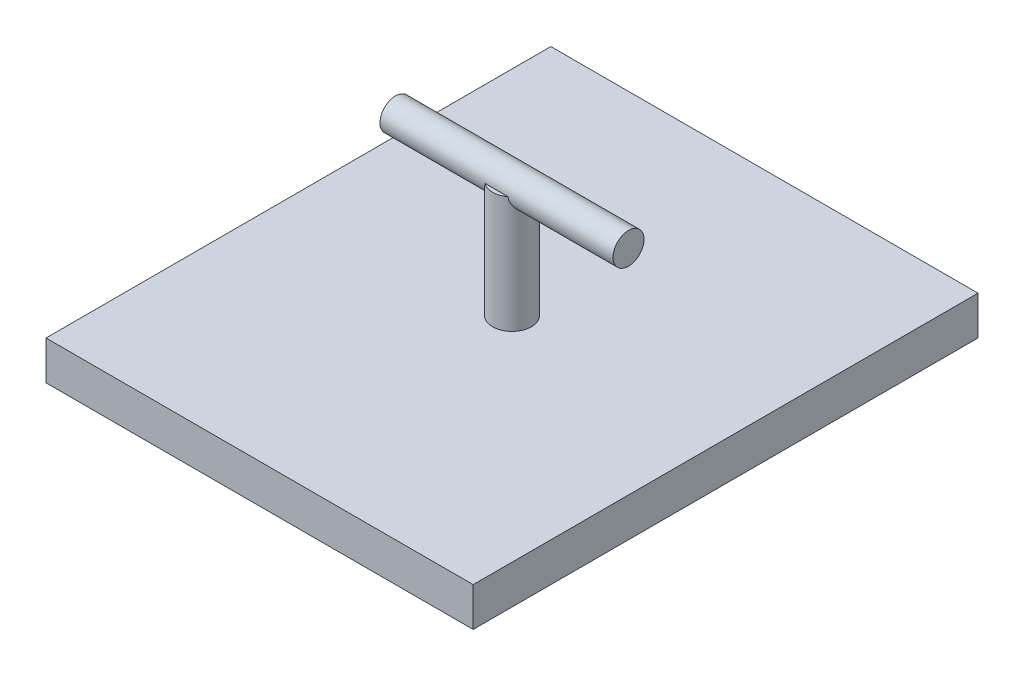
ISO-10303-21;
HEADER;
FILE_DESCRIPTION(('STEP AP214'),'2;1');
FILE_NAME('part.step','',(''),(''),'','','');
FILE_SCHEMA(('AUTOMOTIVE_DESIGN { 1 0 10303 214 1 1 1 1 }'));
ENDSEC;
DATA;
#1=APPLICATION_CONTEXT('core data for automotive mechanical design processes');
#2=APPLICATION_PROTOCOL_DEFINITION('international standard','automotive_design',2000,#1);
#3=PRODUCT_CONTEXT('',#1,'mechanical');
#4=PRODUCT('Part','Part','',(#3));
#5=PRODUCT_RELATED_PRODUCT_CATEGORY('part','',(#4));
#6=PRODUCT_DEFINITION_FORMATION('','',#4);
#7=PRODUCT_DEFINITION_CONTEXT('part definition',#1,'design');
#8=PRODUCT_DEFINITION('design','',#6,#7);
#9=PRODUCT_DEFINITION_SHAPE('','',#8);
#10=(LENGTH_UNIT() NAMED_UNIT(*) SI_UNIT(.MILLI.,.METRE.));
#11=(NAMED_UNIT(*) PLANE_ANGLE_UNIT() SI_UNIT($,.RADIAN.));
#12=(NAMED_UNIT(*) SI_UNIT($,.STERADIAN.) SOLID_ANGLE_UNIT());
#13=UNCERTAINTY_MEASURE_WITH_UNIT(LENGTH_MEASURE(1.E-05),#10,'distance_accuracy_value','');
#14=(GEOMETRIC_REPRESENTATION_CONTEXT(3) GLOBAL_UNCERTAINTY_ASSIGNED_CONTEXT((#13)) GLOBAL_UNIT_ASSIGNED_CONTEXT((#10,
#11,#12)) REPRESENTATION_CONTEXT('',''));
#15=CARTESIAN_POINT('',(0.,0.,0.));
#16=DIRECTION('',(0.,0.,1.));
#17=DIRECTION('',(1.,0.,0.));
#18=AXIS2_PLACEMENT_3D('',#15,#16,#17);
#19=CARTESIAN_POINT('',(29.9999999999999,0.,0.));
#20=DIRECTION('',(1.,0.,0.));
#21=DIRECTION('',(0.,0.,-1.));
#22=AXIS2_PLACEMENT_3D('',#19,#20,#21);
#23=PLANE('',#22);
#24=CARTESIAN_POINT('',(29.9999999999999,0.,0.));
#25=DIRECTION('',(-1.,0.,0.));
#26=DIRECTION('',(0.,0.,1.));
#27=AXIS2_PLACEMENT_3D('',#24,#25,#26);
#28=CIRCLE('',#27,4.);
#29=CARTESIAN_POINT('',(29.9999999999999,0.,4.));
#30=VERTEX_POINT('',#29);
#31=EDGE_CURVE('E138',#30,#30,#28,.T.);
#32=ORIENTED_EDGE('',*,*,#31,.F.);
#33=EDGE_LOOP('',(#32));
#34=FACE_BOUND('',#33,.T.);
#35=ADVANCED_FACE('F43',(#34),#23,.T.);
#36=CARTESIAN_POINT('',(-30.,0.,0.));
#37=DIRECTION('',(-1.,0.,0.));
#38=DIRECTION('',(0.,0.,1.));
#39=AXIS2_PLACEMENT_3D('',#36,#37,#38);
#40=CYLINDRICAL_SURFACE('',#39,4.);
#41=DIRECTION('',(-1.,0.,0.));
#42=VECTOR('',#41,1.);
#43=CARTESIAN_POINT('',(-30.,0.,-4.));
#44=LINE('',#43,#42);
#45=CARTESIAN_POINT('',(-3.,0.,-4.));
#46=VERTEX_POINT('',#45);
#47=CARTESIAN_POINT('',(3.,0.,-4.));
#48=VERTEX_POINT('',#47);
#49=EDGE_CURVE('E11',#46,#48,#44,.F.);
#50=ORIENTED_EDGE('',*,*,#49,.F.);
#51=CARTESIAN_POINT('',(-3.,0.,4.));
#52=CARTESIAN_POINT('',(-2.99995182787822,-0.0758839512120037,4.0000172442197));
#53=CARTESIAN_POINT('',(-3.00287794283945,-0.151737082152613,3.99784133479927));
#54=CARTESIAN_POINT('',(-3.01430346027332,-0.302655166726338,3.98924372965557));
#55=CARTESIAN_POINT('',(-3.02279340760076,-0.377721238393577,3.98282923680378));
#56=CARTESIAN_POINT('',(-3.04482610821815,-0.525609756090726,3.96600676721711));
#57=CARTESIAN_POINT('',(-3.05830014562958,-0.598448764454386,3.95565304776434));
#58=CARTESIAN_POINT('',(-3.08972240011624,-0.742514021673158,3.93115992154878));
#59=CARTESIAN_POINT('',(-3.1076728303431,-0.813739453709919,3.91701864193996));
#60=CARTESIAN_POINT('',(-3.1814203655067,-1.07465465068644,3.85788645632627));
#61=CARTESIAN_POINT('',(-3.24941719011977,-1.258492770828,3.80151495767512));
#62=CARTESIAN_POINT('',(-3.36335898862908,-1.52268734302426,3.70006231378467));
#63=CARTESIAN_POINT('',(-3.40351971759372,-1.60915460496881,3.66324320745199));
#64=CARTESIAN_POINT('',(-3.48663491099409,-1.77820879603121,3.5842231916031));
#65=CARTESIAN_POINT('',(-3.52958842582172,-1.86079702782225,3.54202410675605));
#66=CARTESIAN_POINT('',(-3.63300092902873,-2.05114503474044,3.43635816877644));
#67=CARTESIAN_POINT('',(-3.69420263333461,-2.15728235592877,3.37069881632494));
#68=CARTESIAN_POINT('',(-3.81773266936584,-2.36258179860212,3.23012143767123));
#69=CARTESIAN_POINT('',(-3.88006139113919,-2.46174144477991,3.15520015155313));
#70=CARTESIAN_POINT('',(-4.00395278198727,-2.65271644607596,2.99641106604159));
#71=CARTESIAN_POINT('',(-4.06551678559214,-2.74454679638046,2.91256239738764));
#72=CARTESIAN_POINT('',(-4.18645638811208,-2.92070352963931,2.73588329549457));
#73=CARTESIAN_POINT('',(-4.24583169281856,-3.00502890590162,2.64305166078592));
#74=CARTESIAN_POINT('',(-4.3957561156391,-3.21415196903715,2.38960176282309));
#75=CARTESIAN_POINT('',(-4.48346431084525,-3.3326182944242,2.22191651732621));
#76=CARTESIAN_POINT('',(-4.64330256804725,-3.54472666863029,1.86490701455669));
#77=CARTESIAN_POINT('',(-4.71545396590355,-3.63840275743935,1.67561294576412));
#78=CARTESIAN_POINT('',(-4.82831089934389,-3.78342427646884,1.31063563644204));
#79=CARTESIAN_POINT('',(-4.87221514889498,-3.83916590750086,1.13770363481765));
#80=CARTESIAN_POINT('',(-4.94171963049312,-3.92699890197435,0.782370380917402));
#81=CARTESIAN_POINT('',(-4.96733034656071,-3.95910381194076,0.599974616720662));
#82=CARTESIAN_POINT('',(-4.99815922579613,-3.99771605753087,0.230096381411205));
#83=CARTESIAN_POINT('',(-5.00330645831563,-4.00413435858864,0.0425984816268359));
#84=CARTESIAN_POINT('',(-4.99253869586592,-3.99067147682623,-0.330833896816364));
#85=CARTESIAN_POINT('',(-4.97662285118408,-3.97078923300702,-0.516768312097622));
#86=CARTESIAN_POINT('',(-4.92656782991578,-3.90786469247283,-0.87136305238285));
#87=CARTESIAN_POINT('',(-4.89346948356484,-3.86614416195021,-1.04041248586898));
#88=CARTESIAN_POINT('',(-4.81209238959492,-3.76261270089102,-1.36833589163498));
#89=CARTESIAN_POINT('',(-4.76380908651497,-3.7007957412724,-1.527206793134));
#90=CARTESIAN_POINT('',(-4.64971647646164,-3.55278849968009,-1.84707554506929));
#91=CARTESIAN_POINT('',(-4.58266606832004,-3.46482265359562,-2.00680104886884));
#92=CARTESIAN_POINT('',(-4.43786536967305,-3.27090205959575,-2.30944878399931));
#93=CARTESIAN_POINT('',(-4.360111642347,-3.16494153104913,-2.45236559063698));
#94=CARTESIAN_POINT('',(-4.18111155288389,-2.9139396863621,-2.74845365044915));
#95=CARTESIAN_POINT('',(-4.07832137803861,-2.76534220050287,-2.89769469310453));
#96=CARTESIAN_POINT('',(-3.9221298420074,-2.52718627050552,-3.10230804358847));
#97=CARTESIAN_POINT('',(-3.86965254454364,-2.44512501236429,-3.16738635570626));
#98=CARTESIAN_POINT('',(-3.76507373489572,-2.27600253939464,-3.29101550855261));
#99=CARTESIAN_POINT('',(-3.71297223475636,-2.1889411651004,-3.3495661409223));
#100=CARTESIAN_POINT('',(-3.56862015261604,-1.93722631215424,-3.5047783442769));
#101=CARTESIAN_POINT('',(-3.47799806112874,-1.76679467478675,-3.59393900494401));
#102=CARTESIAN_POINT('',(-3.35285010125728,-1.49923322346361,-3.70966941062843));
#103=CARTESIAN_POINT('',(-3.31303076485051,-1.40833857184373,-3.74516801125376));
#104=CARTESIAN_POINT('',(-3.23834004092699,-1.22233803639522,-3.80993229160584));
#105=CARTESIAN_POINT('',(-3.20346793388259,-1.12723276760636,-3.83919887803084));
#106=CARTESIAN_POINT('',(-3.14570017357785,-0.949345669584446,-3.88660905508885));
#107=CARTESIAN_POINT('',(-3.12177671618877,-0.867177019026397,-3.9057952405824));
#108=CARTESIAN_POINT('',(-3.07962493185848,-0.700427011133482,-3.93911505883391));
#109=CARTESIAN_POINT('',(-3.06139246904959,-0.61584745491202,-3.95325236189381));
#110=CARTESIAN_POINT('',(-3.03139214457791,-0.443409166907625,-3.97631108834135));
#111=CARTESIAN_POINT('',(-3.0197316902085,-0.355519677888376,-3.98514599651582));
#112=CARTESIAN_POINT('',(-3.00398108602478,-0.178443281775607,-3.99701436267849));
#113=CARTESIAN_POINT('',(-2.99991179386177,-0.0892534766609155,-4.00003183731111));
#114=CARTESIAN_POINT('',(-3.00000000000017,0.,-4.00000000000002));
#115=B_SPLINE_CURVE_WITH_KNOTS('',3,(#51,#52,#53,#54,#55,#56,#57,#58,#59,#60,#61,#62,#63,#64,
#65,#66,#67,#68,#69,#70,#71,#72,#73,#74,#75,#76,#77,#78,#79,#80,#81,#82,#83,#84,#85,#86,#87,#88,
#89,#90,#91,#92,#93,#94,#95,#96,#97,#98,#99,#100,#101,#102,#103,#104,#105,#106,#107,#108,#109,
#110,#111,#112,#113,#114),.UNSPECIFIED.,.F.,.F.,(4,2,2,2,2,2,2,2,2,2,2,2,2,2,2,2,2,2,2,2,2,2,2,
2,2,2,2,2,2,2,2,4),(0.,0.227514386943003,0.454643136344802,0.678750566837707,0.902969017631836,
1.51087923212397,1.81735094177795,2.12371898388142,2.54020752782497,2.95684308254033,
3.37260313311497,3.78841886855926,4.45547797636936,5.12161632216695,5.68000290471996,
6.23806921871323,6.79806822770702,7.35808982849605,7.88757946016121,8.41722808957462,
8.99795349172704,9.57886580084644,10.2791805892878,10.6303779353209,10.9815864881139,
11.6169995493873,11.9328954092994,12.248745277946,12.5115441892466,12.7741516672509,
13.0409350062526,13.3084502917263),.UNSPECIFIED.);
#116=CARTESIAN_POINT('',(-3.,0.,4.));
#117=VERTEX_POINT('',#116);
#118=EDGE_CURVE('E146',#117,#46,#115,.T.);
#119=ORIENTED_EDGE('',*,*,#118,.F.);
#120=DIRECTION('',(-1.,0.,0.));
#121=VECTOR('',#120,1.);
#122=CARTESIAN_POINT('',(-30.,0.,4.));
#123=LINE('',#122,#121);
#124=CARTESIAN_POINT('',(3.,0.,4.));
#125=VERTEX_POINT('',#124);
#126=EDGE_CURVE('E142',#125,#117,#123,.T.);
#127=ORIENTED_EDGE('',*,*,#126,.F.);
#128=CARTESIAN_POINT('',(3.,0.,-4.));
#129=CARTESIAN_POINT('',(2.99995182787822,-0.0758839512120037,-4.0000172442197));
#130=CARTESIAN_POINT('',(3.00287794283945,-0.151737082152613,-3.99784133479927));
#131=CARTESIAN_POINT('',(3.01430346027332,-0.302655166726338,-3.98924372965557));
#132=CARTESIAN_POINT('',(3.02279340760076,-0.377721238393577,-3.98282923680378));
#133=CARTESIAN_POINT('',(3.04482610821815,-0.525609756090726,-3.96600676721711));
#134=CARTESIAN_POINT('',(3.05830014562958,-0.598448764454386,-3.95565304776434));
#135=CARTESIAN_POINT('',(3.08972240011624,-0.742514021673158,-3.93115992154878));
#136=CARTESIAN_POINT('',(3.1076728303431,-0.813739453709919,-3.91701864193996));
#137=CARTESIAN_POINT('',(3.1814203655067,-1.07465465068644,-3.85788645632627));
#138=CARTESIAN_POINT('',(3.24941719011977,-1.258492770828,-3.80151495767512));
#139=CARTESIAN_POINT('',(3.36335898862908,-1.52268734302426,-3.70006231378467));
#140=CARTESIAN_POINT('',(3.40351971759372,-1.60915460496881,-3.66324320745199));
#141=CARTESIAN_POINT('',(3.48663491099409,-1.77820879603121,-3.5842231916031));
#142=CARTESIAN_POINT('',(3.52958842582172,-1.86079702782225,-3.54202410675605));
#143=CARTESIAN_POINT('',(3.63300092902873,-2.05114503474044,-3.43635816877644));
#144=CARTESIAN_POINT('',(3.69420263333461,-2.15728235592877,-3.37069881632494));
#145=CARTESIAN_POINT('',(3.81773266936584,-2.36258179860212,-3.23012143767123));
#146=CARTESIAN_POINT('',(3.88006139113919,-2.46174144477991,-3.15520015155313));
#147=CARTESIAN_POINT('',(4.00395278198727,-2.65271644607596,-2.99641106604159));
#148=CARTESIAN_POINT('',(4.06551678559214,-2.74454679638046,-2.91256239738764));
#149=CARTESIAN_POINT('',(4.18645638811208,-2.92070352963931,-2.73588329549457));
#150=CARTESIAN_POINT('',(4.24583169281856,-3.00502890590162,-2.64305166078592));
#151=CARTESIAN_POINT('',(4.3957561156391,-3.21415196903715,-2.38960176282309));
#152=CARTESIAN_POINT('',(4.48346431084525,-3.3326182944242,-2.22191651732621));
#153=CARTESIAN_POINT('',(4.64330256804725,-3.54472666863029,-1.86490701455669));
#154=CARTESIAN_POINT('',(4.71545396590355,-3.63840275743935,-1.67561294576412));
#155=CARTESIAN_POINT('',(4.82831089934389,-3.78342427646884,-1.31063563644204));
#156=CARTESIAN_POINT('',(4.87221514889498,-3.83916590750086,-1.13770363481765));
#157=CARTESIAN_POINT('',(4.94171963049312,-3.92699890197435,-0.782370380917402));
#158=CARTESIAN_POINT('',(4.96733034656071,-3.95910381194076,-0.599974616720662));
#159=CARTESIAN_POINT('',(4.99815922579613,-3.99771605753087,-0.230096381411205));
#160=CARTESIAN_POINT('',(5.00330645831563,-4.00413435858864,-0.0425984816268359));
#161=CARTESIAN_POINT('',(4.99253869586592,-3.99067147682623,0.330833896816364));
#162=CARTESIAN_POINT('',(4.97662285118408,-3.97078923300702,0.516768312097622));
#163=CARTESIAN_POINT('',(4.92656782991578,-3.90786469247283,0.87136305238285));
#164=CARTESIAN_POINT('',(4.89346948356484,-3.86614416195021,1.04041248586898));
#165=CARTESIAN_POINT('',(4.81209238959492,-3.76261270089102,1.36833589163498));
#166=CARTESIAN_POINT('',(4.76380908651497,-3.7007957412724,1.527206793134));
#167=CARTESIAN_POINT('',(4.64971647646164,-3.55278849968009,1.84707554506929));
#168=CARTESIAN_POINT('',(4.58266606832004,-3.46482265359562,2.00680104886884));
#169=CARTESIAN_POINT('',(4.43786536967305,-3.27090205959575,2.30944878399931));
#170=CARTESIAN_POINT('',(4.360111642347,-3.16494153104913,2.45236559063698));
#171=CARTESIAN_POINT('',(4.18111155288389,-2.9139396863621,2.74845365044915));
#172=CARTESIAN_POINT('',(4.07832137803861,-2.76534220050287,2.89769469310453));
#173=CARTESIAN_POINT('',(3.9221298420074,-2.52718627050552,3.10230804358847));
#174=CARTESIAN_POINT('',(3.86965254454364,-2.44512501236429,3.16738635570626));
#175=CARTESIAN_POINT('',(3.76507373489572,-2.27600253939464,3.29101550855261));
#176=CARTESIAN_POINT('',(3.71297223475636,-2.1889411651004,3.3495661409223));
#177=CARTESIAN_POINT('',(3.56862015261604,-1.93722631215424,3.5047783442769));
#178=CARTESIAN_POINT('',(3.47799806112874,-1.76679467478675,3.59393900494401));
#179=CARTESIAN_POINT('',(3.35285010125728,-1.49923322346361,3.70966941062843));
#180=CARTESIAN_POINT('',(3.31303076485051,-1.40833857184373,3.74516801125376));
#181=CARTESIAN_POINT('',(3.23834004092699,-1.22233803639522,3.80993229160584));
#182=CARTESIAN_POINT('',(3.20346793388259,-1.12723276760636,3.83919887803084));
#183=CARTESIAN_POINT('',(3.14570017357785,-0.949345669584446,3.88660905508885));
#184=CARTESIAN_POINT('',(3.12177671618877,-0.867177019026397,3.9057952405824));
#185=CARTESIAN_POINT('',(3.07962493185848,-0.700427011133482,3.93911505883391));
#186=CARTESIAN_POINT('',(3.06139246904959,-0.61584745491202,3.95325236189381));
#187=CARTESIAN_POINT('',(3.03139214457791,-0.443409166907625,3.97631108834135));
#188=CARTESIAN_POINT('',(3.0197316902085,-0.355519677888376,3.98514599651582));
#189=CARTESIAN_POINT('',(3.00398108602478,-0.178443281775607,3.99701436267849));
#190=CARTESIAN_POINT('',(2.99991179386177,-0.0892534766609155,4.00003183731111));
#191=CARTESIAN_POINT('',(3.00000000000017,0.,4.00000000000002));
#192=B_SPLINE_CURVE_WITH_KNOTS('',3,(#128,#129,#130,#131,#132,#133,#134,#135,#136,#137,#138,
#139,#140,#141,#142,#143,#144,#145,#146,#147,#148,#149,#150,#151,#152,#153,#154,#155,#156,#157,
#158,#159,#160,#161,#162,#163,#164,#165,#166,#167,#168,#169,#170,#171,#172,#173,#174,#175,#176,
#177,#178,#179,#180,#181,#182,#183,#184,#185,#186,#187,#188,#189,#190,#191),.UNSPECIFIED.,.F.,
.F.,(4,2,2,2,2,2,2,2,2,2,2,2,2,2,2,2,2,2,2,2,2,2,2,2,2,2,2,2,2,2,2,4),(0.,0.227514386943003,
0.454643136344802,0.678750566837707,0.902969017631836,1.51087923212397,1.81735094177795,
2.12371898388142,2.54020752782497,2.95684308254033,3.37260313311497,3.78841886855926,
4.45547797636936,5.12161632216695,5.68000290471996,6.23806921871323,6.79806822770702,
7.35808982849605,7.88757946016121,8.41722808957462,8.99795349172704,9.57886580084644,
10.2791805892878,10.6303779353209,10.9815864881139,11.6169995493873,11.9328954092994,
12.248745277946,12.5115441892466,12.7741516672509,13.0409350062526,13.3084502917263),.UNSPECIFIED.);
#193=EDGE_CURVE('E51',#48,#125,#192,.T.);
#194=ORIENTED_EDGE('',*,*,#193,.F.);
#195=EDGE_LOOP('',(#50,#119,#127,#194));
#196=FACE_BOUND('',#195,.T.);
#197=ORIENTED_EDGE('',*,*,#31,.T.);
#198=EDGE_LOOP('',(#197));
#199=FACE_BOUND('',#198,.T.);
#200=CARTESIAN_POINT('',(-30.,0.,0.));
#201=DIRECTION('',(-1.,0.,0.));
#202=DIRECTION('',(0.,0.,1.));
#203=AXIS2_PLACEMENT_3D('',#200,#201,#202);
#204=CIRCLE('',#203,4.);
#205=CARTESIAN_POINT('',(-30.,0.,4.));
#206=VERTEX_POINT('',#205);
#207=EDGE_CURVE('E134',#206,#206,#204,.T.);
#208=ORIENTED_EDGE('',*,*,#207,.F.);
#209=EDGE_LOOP('',(#208));
#210=FACE_BOUND('',#209,.T.);
#211=ADVANCED_FACE('F157',(#196,#199,#210),#40,.T.);
#212=CARTESIAN_POINT('',(-30.,0.,0.));
#213=DIRECTION('',(1.,0.,0.));
#214=DIRECTION('',(0.,0.,-1.));
#215=AXIS2_PLACEMENT_3D('',#212,#213,#214);
#216=PLANE('',#215);
#217=ORIENTED_EDGE('',*,*,#207,.T.);
#218=EDGE_LOOP('',(#217));
#219=FACE_BOUND('',#218,.T.);
#220=ADVANCED_FACE('F168',(#219),#216,.F.);
#221=CARTESIAN_POINT('',(0.,0.,0.));
#222=DIRECTION('',(0.,1.,0.));
#223=DIRECTION('',(0.,0.,1.));
#224=AXIS2_PLACEMENT_3D('',#221,#222,#223);
#225=PLANE('',#224);
#226=CARTESIAN_POINT('',(0.,0.,0.));
#227=DIRECTION('',(0.,1.,0.));
#228=DIRECTION('',(0.,0.,1.));
#229=AXIS2_PLACEMENT_3D('',#226,#227,#228);
#230=CIRCLE('',#229,5.);
#231=EDGE_CURVE('E133',#48,#46,#230,.T.);
#232=ORIENTED_EDGE('',*,*,#231,.T.);
#233=ORIENTED_EDGE('',*,*,#49,.T.);
#234=EDGE_LOOP('',(#232,#233));
#235=FACE_BOUND('',#234,.T.);
#236=ADVANCED_FACE('F165',(#235),#225,.T.);
#237=CARTESIAN_POINT('',(0.,-30.,0.));
#238=DIRECTION('',(0.,1.,0.));
#239=DIRECTION('',(0.,0.,1.));
#240=AXIS2_PLACEMENT_3D('',#237,#238,#239);
#241=CYLINDRICAL_SURFACE('',#240,5.);
#242=CARTESIAN_POINT('',(0.,-30.,0.));
#243=DIRECTION('',(0.,1.,0.));
#244=DIRECTION('',(0.,0.,1.));
#245=AXIS2_PLACEMENT_3D('',#242,#243,#244);
#246=CIRCLE('',#245,5.);
#247=CARTESIAN_POINT('',(0.,-30.,5.));
#248=VERTEX_POINT('',#247);
#249=EDGE_CURVE('E119',#248,#248,#246,.T.);
#250=ORIENTED_EDGE('',*,*,#249,.T.);
#251=EDGE_LOOP('',(#250));
#252=FACE_BOUND('',#251,.T.);
#253=ORIENTED_EDGE('',*,*,#231,.F.);
#254=ORIENTED_EDGE('',*,*,#193,.T.);
#255=EDGE_CURVE('E124',#117,#125,#230,.T.);
#256=ORIENTED_EDGE('',*,*,#255,.F.);
#257=ORIENTED_EDGE('',*,*,#118,.T.);
#258=EDGE_LOOP('',(#253,#254,#256,#257));
#259=FACE_BOUND('',#258,.T.);
#260=ADVANCED_FACE('F160',(#252,#259),#241,.T.);
#261=ORIENTED_EDGE('',*,*,#255,.T.);
#262=ORIENTED_EDGE('',*,*,#126,.T.);
#263=EDGE_LOOP('',(#261,#262));
#264=FACE_BOUND('',#263,.T.);
#265=ADVANCED_FACE('F164',(#264),#225,.T.);
#266=CARTESIAN_POINT('',(55.,-40.,65.));
#267=DIRECTION('',(-1.,0.,0.));
#268=DIRECTION('',(0.,0.,1.));
#269=AXIS2_PLACEMENT_3D('',#266,#267,#268);
#270=PLANE('',#269);
#271=DIRECTION('',(0.,0.,1.));
#272=VECTOR('',#271,1.);
#273=CARTESIAN_POINT('',(55.,-30.,65.));
#274=LINE('',#273,#272);
#275=CARTESIAN_POINT('',(55.,-30.,-65.));
#276=VERTEX_POINT('',#275);
#277=CARTESIAN_POINT('',(55.,-30.,65.));
#278=VERTEX_POINT('',#277);
#279=EDGE_CURVE('E117',#276,#278,#274,.T.);
#280=ORIENTED_EDGE('',*,*,#279,.T.);
#281=DIRECTION('',(0.,1.,0.));
#282=VECTOR('',#281,1.);
#283=CARTESIAN_POINT('',(55.,-40.,65.));
#284=LINE('',#283,#282);
#285=CARTESIAN_POINT('',(55.,-40.,65.));
#286=VERTEX_POINT('',#285);
#287=EDGE_CURVE('E95',#286,#278,#284,.T.);
#288=ORIENTED_EDGE('',*,*,#287,.F.);
#289=DIRECTION('',(0.,0.,1.));
#290=VECTOR('',#289,1.);
#291=CARTESIAN_POINT('',(55.,-40.,65.));
#292=LINE('',#291,#290);
#293=CARTESIAN_POINT('',(55.,-40.,-65.));
#294=VERTEX_POINT('',#293);
#295=EDGE_CURVE('E103',#294,#286,#292,.T.);
#296=ORIENTED_EDGE('',*,*,#295,.F.);
#297=DIRECTION('',(0.,1.,0.));
#298=VECTOR('',#297,1.);
#299=CARTESIAN_POINT('',(55.,-40.,-65.));
#300=LINE('',#299,#298);
#301=EDGE_CURVE('E285',#294,#276,#300,.T.);
#302=ORIENTED_EDGE('',*,*,#301,.T.);
#303=EDGE_LOOP('',(#280,#288,#296,#302));
#304=FACE_BOUND('',#303,.T.);
#305=ADVANCED_FACE('F115',(#304),#270,.F.);
#306=CARTESIAN_POINT('',(-55.,-40.,65.));
#307=DIRECTION('',(0.,0.,-1.));
#308=DIRECTION('',(-1.,0.,0.));
#309=AXIS2_PLACEMENT_3D('',#306,#307,#308);
#310=PLANE('',#309);
#311=DIRECTION('',(-1.,0.,0.));
#312=VECTOR('',#311,1.);
#313=CARTESIAN_POINT('',(-55.,-30.,65.));
#314=LINE('',#313,#312);
#315=CARTESIAN_POINT('',(-55.,-30.,65.));
#316=VERTEX_POINT('',#315);
#317=EDGE_CURVE('E272',#278,#316,#314,.T.);
#318=ORIENTED_EDGE('',*,*,#317,.T.);
#319=DIRECTION('',(0.,1.,0.));
#320=VECTOR('',#319,1.);
#321=CARTESIAN_POINT('',(-55.,-40.,65.));
#322=LINE('',#321,#320);
#323=CARTESIAN_POINT('',(-55.,-40.,65.));
#324=VERTEX_POINT('',#323);
#325=EDGE_CURVE('E98',#324,#316,#322,.T.);
#326=ORIENTED_EDGE('',*,*,#325,.F.);
#327=DIRECTION('',(-1.,0.,0.));
#328=VECTOR('',#327,1.);
#329=CARTESIAN_POINT('',(-55.,-40.,65.));
#330=LINE('',#329,#328);
#331=EDGE_CURVE('E91',#286,#324,#330,.T.);
#332=ORIENTED_EDGE('',*,*,#331,.F.);
#333=ORIENTED_EDGE('',*,*,#287,.T.);
#334=EDGE_LOOP('',(#318,#326,#332,#333));
#335=FACE_BOUND('',#334,.T.);
#336=ADVANCED_FACE('F93',(#335),#310,.F.);
#337=CARTESIAN_POINT('',(-55.,-40.,65.));
#338=DIRECTION('',(1.,0.,0.));
#339=DIRECTION('',(0.,0.,-1.));
#340=AXIS2_PLACEMENT_3D('',#337,#338,#339);
#341=PLANE('',#340);
#342=DIRECTION('',(0.,0.,-1.));
#343=VECTOR('',#342,1.);
#344=CARTESIAN_POINT('',(-55.,-30.,65.));
#345=LINE('',#344,#343);
#346=CARTESIAN_POINT('',(-55.,-30.,-65.));
#347=VERTEX_POINT('',#346);
#348=EDGE_CURVE('E276',#316,#347,#345,.T.);
#349=ORIENTED_EDGE('',*,*,#348,.T.);
#350=DIRECTION('',(0.,1.,0.));
#351=VECTOR('',#350,1.);
#352=CARTESIAN_POINT('',(-55.,-40.,-65.));
#353=LINE('',#352,#351);
#354=CARTESIAN_POINT('',(-55.,-40.,-65.));
#355=VERTEX_POINT('',#354);
#356=EDGE_CURVE('E126',#355,#347,#353,.T.);
#357=ORIENTED_EDGE('',*,*,#356,.F.);
#358=DIRECTION('',(0.,0.,-1.));
#359=VECTOR('',#358,1.);
#360=CARTESIAN_POINT('',(-55.,-40.,65.));
#361=LINE('',#360,#359);
#362=EDGE_CURVE('E102',#324,#355,#361,.T.);
#363=ORIENTED_EDGE('',*,*,#362,.F.);
#364=ORIENTED_EDGE('',*,*,#325,.T.);
#365=EDGE_LOOP('',(#349,#357,#363,#364));
#366=FACE_BOUND('',#365,.T.);
#367=ADVANCED_FACE('F227',(#366),#341,.F.);
#368=CARTESIAN_POINT('',(-55.,-40.,-65.));
#369=DIRECTION('',(0.,0.,1.));
#370=DIRECTION('',(1.,0.,0.));
#371=AXIS2_PLACEMENT_3D('',#368,#369,#370);
#372=PLANE('',#371);
#373=DIRECTION('',(1.,0.,0.));
#374=VECTOR('',#373,1.);
#375=CARTESIAN_POINT('',(-55.,-30.,-65.));
#376=LINE('',#375,#374);
#377=EDGE_CURVE('E113',#347,#276,#376,.T.);
#378=ORIENTED_EDGE('',*,*,#377,.T.);
#379=ORIENTED_EDGE('',*,*,#301,.F.);
#380=DIRECTION('',(1.,0.,0.));
#381=VECTOR('',#380,1.);
#382=CARTESIAN_POINT('',(-55.,-40.,-65.));
#383=LINE('',#382,#381);
#384=EDGE_CURVE('E108',#355,#294,#383,.T.);
#385=ORIENTED_EDGE('',*,*,#384,.F.);
#386=ORIENTED_EDGE('',*,*,#356,.T.);
#387=EDGE_LOOP('',(#378,#379,#385,#386));
#388=FACE_BOUND('',#387,.T.);
#389=ADVANCED_FACE('F236',(#388),#372,.F.);
#390=CARTESIAN_POINT('',(0.,-40.,0.));
#391=DIRECTION('',(0.,-1.,0.));
#392=DIRECTION('',(0.,0.,-1.));
#393=AXIS2_PLACEMENT_3D('',#390,#391,#392);
#394=PLANE('',#393);
#395=ORIENTED_EDGE('',*,*,#295,.T.);
#396=ORIENTED_EDGE('',*,*,#331,.T.);
#397=ORIENTED_EDGE('',*,*,#362,.T.);
#398=ORIENTED_EDGE('',*,*,#384,.T.);
#399=EDGE_LOOP('',(#395,#396,#397,#398));
#400=FACE_BOUND('',#399,.T.);
#401=ADVANCED_FACE('F106',(#400),#394,.T.);
#402=CARTESIAN_POINT('',(0.,-30.,0.));
#403=DIRECTION('',(0.,-1.,0.));
#404=DIRECTION('',(0.,0.,-1.));
#405=AXIS2_PLACEMENT_3D('',#402,#403,#404);
#406=PLANE('',#405);
#407=ORIENTED_EDGE('',*,*,#249,.F.);
#408=EDGE_LOOP('',(#407));
#409=FACE_BOUND('',#408,.T.);
#410=ORIENTED_EDGE('',*,*,#279,.F.);
#411=ORIENTED_EDGE('',*,*,#377,.F.);
#412=ORIENTED_EDGE('',*,*,#348,.F.);
#413=ORIENTED_EDGE('',*,*,#317,.F.);
#414=EDGE_LOOP('',(#410,#411,#412,#413));
#415=FACE_BOUND('',#414,.T.);
#416=ADVANCED_FACE('F255',(#409,#415),#406,.F.);
#417=CLOSED_SHELL('',(#35,#211,#220,#236,#260,#265,#305,#336,#367,#389,#401,#416));
#418=MANIFOLD_SOLID_BREP('B2',#417);
#419=ADVANCED_BREP_SHAPE_REPRESENTATION('',(#18,#418),#14);
#420=SHAPE_DEFINITION_REPRESENTATION(#9,#419);
ENDSEC;
END-ISO-10303-21;
